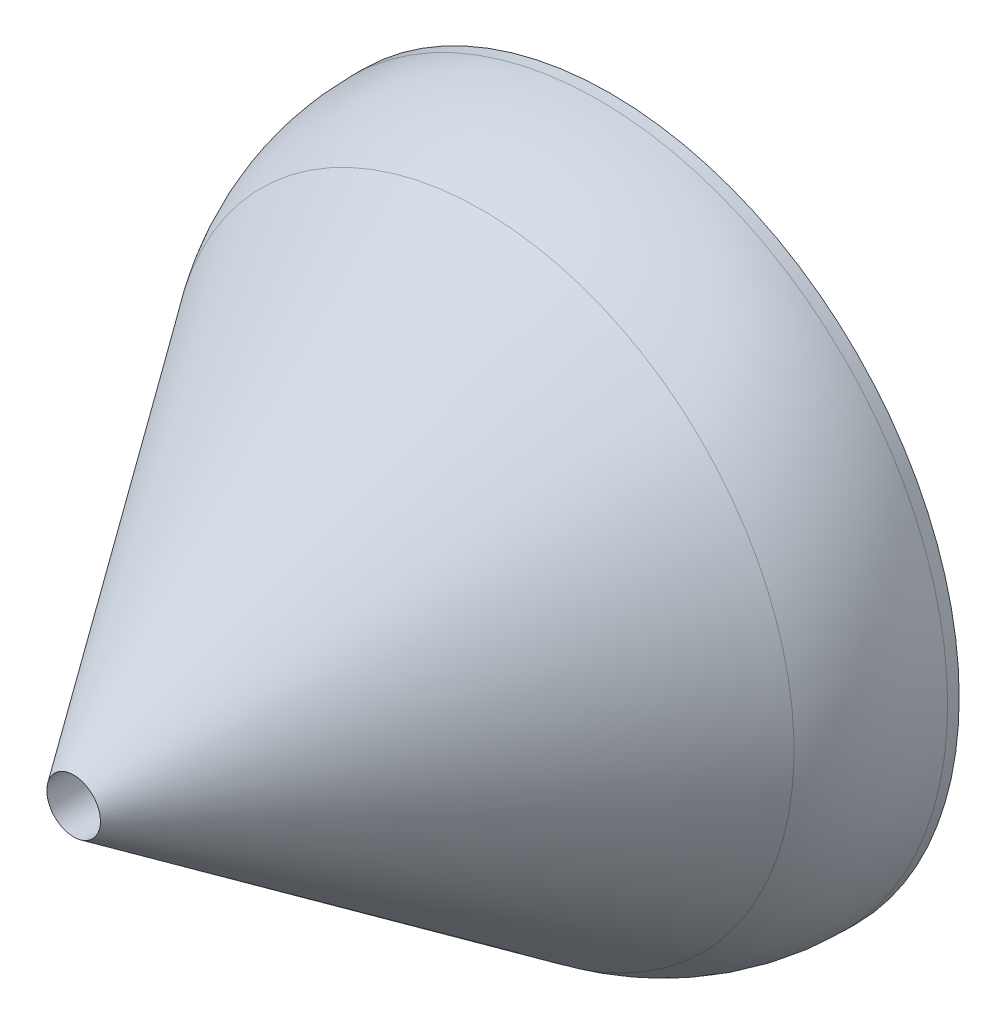
ISO-10303-21;
HEADER;
FILE_DESCRIPTION(('STEP AP214'),'2;1');
FILE_NAME('part.step','',(''),(''),'','','');
FILE_SCHEMA(('AUTOMOTIVE_DESIGN { 1 0 10303 214 1 1 1 1 }'));
ENDSEC;
DATA;
#1=APPLICATION_CONTEXT('core data for automotive mechanical design processes');
#2=APPLICATION_PROTOCOL_DEFINITION('international standard','automotive_design',2000,#1);
#3=PRODUCT_CONTEXT('',#1,'mechanical');
#4=PRODUCT('Part','Part','',(#3));
#5=PRODUCT_RELATED_PRODUCT_CATEGORY('part','',(#4));
#6=PRODUCT_DEFINITION_FORMATION('','',#4);
#7=PRODUCT_DEFINITION_CONTEXT('part definition',#1,'design');
#8=PRODUCT_DEFINITION('design','',#6,#7);
#9=PRODUCT_DEFINITION_SHAPE('','',#8);
#10=(LENGTH_UNIT() NAMED_UNIT(*) SI_UNIT(.MILLI.,.METRE.));
#11=(NAMED_UNIT(*) PLANE_ANGLE_UNIT() SI_UNIT($,.RADIAN.));
#12=(NAMED_UNIT(*) SI_UNIT($,.STERADIAN.) SOLID_ANGLE_UNIT());
#13=UNCERTAINTY_MEASURE_WITH_UNIT(LENGTH_MEASURE(1.E-05),#10,'distance_accuracy_value','');
#14=(GEOMETRIC_REPRESENTATION_CONTEXT(3) GLOBAL_UNCERTAINTY_ASSIGNED_CONTEXT((#13)) GLOBAL_UNIT_ASSIGNED_CONTEXT((#10,
#11,#12)) REPRESENTATION_CONTEXT('',''));
#15=CARTESIAN_POINT('',(0.,0.,0.));
#16=DIRECTION('',(0.,0.,1.));
#17=DIRECTION('',(1.,0.,0.));
#18=AXIS2_PLACEMENT_3D('',#15,#16,#17);
#19=CARTESIAN_POINT('',(0.,-82.55,0.));
#20=DIRECTION('',(0.,0.,1.));
#21=DIRECTION('',(1.,0.,0.));
#22=AXIS2_PLACEMENT_3D('',#19,#20,#21);
#23=PLANE('',#22);
#24=CARTESIAN_POINT('',(0.,0.,0.));
#25=DIRECTION('',(0.,0.,-1.));
#26=DIRECTION('',(-1.,0.,0.));
#27=AXIS2_PLACEMENT_3D('',#24,#25,#26);
#28=CIRCLE('',#27,63.5);
#29=CARTESIAN_POINT('',(-63.5,0.,0.));
#30=VERTEX_POINT('',#29);
#31=EDGE_CURVE('E50',#30,#30,#28,.T.);
#32=ORIENTED_EDGE('',*,*,#31,.F.);
#33=EDGE_LOOP('',(#32));
#34=FACE_BOUND('',#33,.T.);
#35=CARTESIAN_POINT('',(0.,0.,0.));
#36=DIRECTION('',(0.,0.,-1.));
#37=DIRECTION('',(-1.,0.,0.));
#38=AXIS2_PLACEMENT_3D('',#35,#36,#37);
#39=CIRCLE('',#38,82.55);
#40=CARTESIAN_POINT('',(-82.55,0.,0.));
#41=VERTEX_POINT('',#40);
#42=EDGE_CURVE('E77',#41,#41,#39,.T.);
#43=ORIENTED_EDGE('',*,*,#42,.T.);
#44=EDGE_LOOP('',(#43));
#45=FACE_BOUND('',#44,.T.);
#46=ADVANCED_FACE('F39',(#34,#45),#23,.F.);
#47=CARTESIAN_POINT('',(0.,0.,0.));
#48=DIRECTION('',(0.,0.,-1.));
#49=DIRECTION('',(-1.,0.,0.));
#50=AXIS2_PLACEMENT_3D('',#47,#48,#49);
#51=CYLINDRICAL_SURFACE('',#50,63.5);
#52=CARTESIAN_POINT('',(0.,0.,17.9279650369389));
#53=DIRECTION('',(0.,0.,-1.));
#54=DIRECTION('',(-1.,0.,0.));
#55=AXIS2_PLACEMENT_3D('',#52,#53,#54);
#56=CIRCLE('',#55,63.5);
#57=CARTESIAN_POINT('',(-63.5,0.,17.9279650369389));
#58=VERTEX_POINT('',#57);
#59=EDGE_CURVE('E54',#58,#58,#56,.T.);
#60=ORIENTED_EDGE('',*,*,#59,.F.);
#61=EDGE_LOOP('',(#60));
#62=FACE_BOUND('',#61,.T.);
#63=ORIENTED_EDGE('',*,*,#31,.T.);
#64=EDGE_LOOP('',(#63));
#65=FACE_BOUND('',#64,.T.);
#66=ADVANCED_FACE('F94',(#62,#65),#51,.F.);
#67=CARTESIAN_POINT('',(0.,0.,17.9279650369389));
#68=DIRECTION('',(0.,0.,-1.));
#69=DIRECTION('',(-1.,0.,0.));
#70=AXIS2_PLACEMENT_3D('',#67,#68,#69);
#71=CONICAL_SURFACE('',#70,63.5,0.609799774213929);
#72=CARTESIAN_POINT('',(0.,0.,56.8087310586471));
#73=DIRECTION('',(0.,0.,-1.));
#74=DIRECTION('',(-1.,0.,0.));
#75=AXIS2_PLACEMENT_3D('',#72,#73,#74);
#76=CIRCLE('',#75,36.3370854008772);
#77=CARTESIAN_POINT('',(-36.3370854008772,0.,56.8087310586471));
#78=VERTEX_POINT('',#77);
#79=EDGE_CURVE('E59',#78,#78,#76,.T.);
#80=ORIENTED_EDGE('',*,*,#79,.F.);
#81=EDGE_LOOP('',(#80));
#82=FACE_BOUND('',#81,.T.);
#83=ORIENTED_EDGE('',*,*,#59,.T.);
#84=EDGE_LOOP('',(#83));
#85=FACE_BOUND('',#84,.T.);
#86=ADVANCED_FACE('F99',(#82,#85),#71,.F.);
#87=CARTESIAN_POINT('',(0.,-36.3370854008772,56.8087310586471));
#88=DIRECTION('',(0.,0.,1.));
#89=DIRECTION('',(1.,0.,0.));
#90=AXIS2_PLACEMENT_3D('',#87,#88,#89);
#91=PLANE('',#90);
#92=CARTESIAN_POINT('',(0.,0.,56.8087310586471));
#93=DIRECTION('',(0.,0.,-1.));
#94=DIRECTION('',(-1.,0.,0.));
#95=AXIS2_PLACEMENT_3D('',#92,#93,#94);
#96=CIRCLE('',#95,6.35000000000001);
#97=CARTESIAN_POINT('',(-6.35000000000001,0.,56.8087310586471));
#98=VERTEX_POINT('',#97);
#99=EDGE_CURVE('E62',#98,#98,#96,.T.);
#100=ORIENTED_EDGE('',*,*,#99,.F.);
#101=EDGE_LOOP('',(#100));
#102=FACE_BOUND('',#101,.T.);
#103=ORIENTED_EDGE('',*,*,#79,.T.);
#104=EDGE_LOOP('',(#103));
#105=FACE_BOUND('',#104,.T.);
#106=ADVANCED_FACE('F106',(#102,#105),#91,.F.);
#107=CARTESIAN_POINT('',(0.,0.,0.));
#108=DIRECTION('',(0.,0.,-1.));
#109=DIRECTION('',(-1.,0.,0.));
#110=AXIS2_PLACEMENT_3D('',#107,#108,#109);
#111=CYLINDRICAL_SURFACE('',#110,6.35000000000001);
#112=CARTESIAN_POINT('',(0.,0.,69.5087310586471));
#113=DIRECTION('',(0.,0.,-1.));
#114=DIRECTION('',(-1.,0.,0.));
#115=AXIS2_PLACEMENT_3D('',#112,#113,#114);
#116=CIRCLE('',#115,6.35000000000001);
#117=CARTESIAN_POINT('',(-6.35000000000001,0.,69.5087310586471));
#118=VERTEX_POINT('',#117);
#119=EDGE_CURVE('E65',#118,#118,#116,.T.);
#120=ORIENTED_EDGE('',*,*,#119,.F.);
#121=EDGE_LOOP('',(#120));
#122=FACE_BOUND('',#121,.T.);
#123=ORIENTED_EDGE('',*,*,#99,.T.);
#124=EDGE_LOOP('',(#123));
#125=FACE_BOUND('',#124,.T.);
#126=ADVANCED_FACE('F110',(#122,#125),#111,.F.);
#127=CARTESIAN_POINT('',(0.,-6.35000000000001,69.5087310586471));
#128=DIRECTION('',(0.,0.,-1.));
#129=DIRECTION('',(-1.,0.,0.));
#130=AXIS2_PLACEMENT_3D('',#127,#128,#129);
#131=PLANE('',#130);
#132=CARTESIAN_POINT('',(0.,0.,69.5087310586471));
#133=DIRECTION('',(0.,0.,-1.));
#134=DIRECTION('',(-1.,0.,0.));
#135=AXIS2_PLACEMENT_3D('',#132,#133,#134);
#136=CIRCLE('',#135,27.4646003470526);
#137=CARTESIAN_POINT('',(-27.4646003470526,0.,69.5087310586471));
#138=VERTEX_POINT('',#137);
#139=EDGE_CURVE('E68',#138,#138,#136,.T.);
#140=ORIENTED_EDGE('',*,*,#139,.F.);
#141=EDGE_LOOP('',(#140));
#142=FACE_BOUND('',#141,.T.);
#143=ORIENTED_EDGE('',*,*,#119,.T.);
#144=EDGE_LOOP('',(#143));
#145=FACE_BOUND('',#144,.T.);
#146=ADVANCED_FACE('F114',(#142,#145),#131,.F.);
#147=CARTESIAN_POINT('',(0.,0.,69.5087310586471));
#148=DIRECTION('',(0.,0.,-1.));
#149=DIRECTION('',(-1.,0.,0.));
#150=AXIS2_PLACEMENT_3D('',#147,#148,#149);
#151=CONICAL_SURFACE('',#150,27.4646003470526,0.609799774213929);
#152=CARTESIAN_POINT('',(0.,0.,99.7319912592347));
#153=DIRECTION('',(0.,0.,-1.));
#154=DIRECTION('',(-1.,0.,0.));
#155=AXIS2_PLACEMENT_3D('',#152,#153,#154);
#156=CIRCLE('',#155,6.35000000000004);
#157=CARTESIAN_POINT('',(-6.35000000000004,0.,99.7319912592347));
#158=VERTEX_POINT('',#157);
#159=EDGE_CURVE('E71',#158,#158,#156,.T.);
#160=CARTESIAN_POINT('',(-6.35000000000004,0.,99.7319912592347));
#161=CARTESIAN_POINT('',(-6.56994375361517,0.,99.4171656321453));
#162=CARTESIAN_POINT('',(-6.7898875072303,0.,99.1023400050558));
#163=CARTESIAN_POINT('',(-7.22977501446056,0.,98.4726887508769));
#164=CARTESIAN_POINT('',(-7.44971876807569,0.,98.1578631237875));
#165=CARTESIAN_POINT('',(-7.88960627530595,0.,97.5282118696086));
#166=CARTESIAN_POINT('',(-8.10955002892108,0.,97.2133862425191));
#167=CARTESIAN_POINT('',(-8.54943753615134,0.,96.5837349883402));
#168=CARTESIAN_POINT('',(-8.76938128976647,0.,96.2689093612507));
#169=CARTESIAN_POINT('',(-9.20926879699673,0.,95.6392581070718));
#170=CARTESIAN_POINT('',(-9.42921255061187,0.,95.3244324799824));
#171=CARTESIAN_POINT('',(-9.86910005784213,0.,94.6947812258035));
#172=CARTESIAN_POINT('',(-10.0890438114573,0.,94.379955598714));
#173=CARTESIAN_POINT('',(-10.5289313186875,0.,93.7503043445351));
#174=CARTESIAN_POINT('',(-10.7488750723026,0.,93.4354787174457));
#175=CARTESIAN_POINT('',(-11.1887625795329,0.,92.8058274632668));
#176=CARTESIAN_POINT('',(-11.408706333148,0.,92.4910018361773));
#177=CARTESIAN_POINT('',(-11.8485938403783,0.,91.8613505819984));
#178=CARTESIAN_POINT('',(-12.0685375939934,0.,91.5465249549089));
#179=CARTESIAN_POINT('',(-12.5084251012237,0.,90.91687370073));
#180=CARTESIAN_POINT('',(-12.7283688548388,0.,90.6020480736406));
#181=CARTESIAN_POINT('',(-13.1682563620691,0.,89.9723968194617));
#182=CARTESIAN_POINT('',(-13.3882001156842,0.,89.6575711923722));
#183=CARTESIAN_POINT('',(-13.8280876229145,0.,89.0279199381933));
#184=CARTESIAN_POINT('',(-14.0480313765296,0.,88.7130943111038));
#185=CARTESIAN_POINT('',(-14.4879188837599,0.,88.0834430569249));
#186=CARTESIAN_POINT('',(-14.707862637375,0.,87.7686174298355));
#187=CARTESIAN_POINT('',(-15.1477501446053,0.,87.1389661756566));
#188=CARTESIAN_POINT('',(-15.3676938982204,0.,86.8241405485671));
#189=CARTESIAN_POINT('',(-15.8075814054506,0.,86.1944892943882));
#190=CARTESIAN_POINT('',(-16.0275251590658,0.,85.8796636672988));
#191=CARTESIAN_POINT('',(-16.467412666296,0.,85.2500124131198));
#192=CARTESIAN_POINT('',(-16.6873564199112,0.,84.9351867860304));
#193=CARTESIAN_POINT('',(-17.1272439271414,0.,84.3055355318515));
#194=CARTESIAN_POINT('',(-17.3471876807566,0.,83.990709904762));
#195=CARTESIAN_POINT('',(-17.7870751879868,0.,83.3610586505831));
#196=CARTESIAN_POINT('',(-18.007018941602,0.,83.0462330234937));
#197=CARTESIAN_POINT('',(-18.4469064488322,0.,82.4165817693148));
#198=CARTESIAN_POINT('',(-18.6668502024474,0.,82.1017561422253));
#199=CARTESIAN_POINT('',(-19.1067377096776,0.,81.4721048880464));
#200=CARTESIAN_POINT('',(-19.3266814632927,0.,81.1572792609569));
#201=CARTESIAN_POINT('',(-19.766568970523,0.,80.527628006778));
#202=CARTESIAN_POINT('',(-19.9865127241381,0.,80.2128023796886));
#203=CARTESIAN_POINT('',(-20.4264002313684,0.,79.5831511255097));
#204=CARTESIAN_POINT('',(-20.6463439849835,0.,79.2683254984202));
#205=CARTESIAN_POINT('',(-21.0862314922138,0.,78.6386742442413));
#206=CARTESIAN_POINT('',(-21.3061752458289,0.,78.3238486171518));
#207=CARTESIAN_POINT('',(-21.7460627530592,0.,77.6941973629729));
#208=CARTESIAN_POINT('',(-21.9660065066743,0.,77.3793717358835));
#209=CARTESIAN_POINT('',(-22.4058940139046,0.,76.7497204817046));
#210=CARTESIAN_POINT('',(-22.6258377675197,0.,76.4348948546151));
#211=CARTESIAN_POINT('',(-23.06572527475,0.,75.8052436004362));
#212=CARTESIAN_POINT('',(-23.2856690283651,0.,75.4904179733468));
#213=CARTESIAN_POINT('',(-23.7255565355954,0.,74.8607667191678));
#214=CARTESIAN_POINT('',(-23.9455002892105,0.,74.5459410920784));
#215=CARTESIAN_POINT('',(-24.3853877964407,0.,73.9162898378995));
#216=CARTESIAN_POINT('',(-24.6053315500559,0.,73.60146421081));
#217=CARTESIAN_POINT('',(-25.0452190572861,0.,72.9718129566311));
#218=CARTESIAN_POINT('',(-25.2651628109013,0.,72.6569873295417));
#219=CARTESIAN_POINT('',(-25.7050503181315,0.,72.0273360753628));
#220=CARTESIAN_POINT('',(-25.9249940717467,0.,71.7125104482733));
#221=CARTESIAN_POINT('',(-26.3648815789769,0.,71.0828591940944));
#222=CARTESIAN_POINT('',(-26.5848253325921,0.,70.7680335670049));
#223=CARTESIAN_POINT('',(-27.0247128398223,0.,70.138382312826));
#224=CARTESIAN_POINT('',(-27.2446565934374,0.,69.8235566857366));
#225=CARTESIAN_POINT('',(-27.4646003470526,0.,69.5087310586471));
#226=B_SPLINE_CURVE_WITH_KNOTS('',3,(#160,#161,#162,#163,#164,#165,#166,#167,#168,#169,#170,
#171,#172,#173,#174,#175,#176,#177,#178,#179,#180,#181,#182,#183,#184,#185,#186,#187,#188,#189,
#190,#191,#192,#193,#194,#195,#196,#197,#198,#199,#200,#201,#202,#203,#204,#205,#206,#207,#208,
#209,#210,#211,#212,#213,#214,#215,#216,#217,#218,#219,#220,#221,#222,#223,#224,#225),
.UNSPECIFIED.,.F.,.F.,(4,2,2,2,2,2,2,2,2,2,2,2,2,2,2,2,2,2,2,2,2,2,2,2,2,2,2,2,2,2,2,2,4),(0.,
1.15213448522264,2.30426897044528,3.45640345566792,4.60853794089055,5.76067242611319,
6.91280691133582,8.06494139655846,9.2170758817811,10.3692103670037,11.5213448522264,
12.673479337449,13.8256138226717,14.9777483078943,16.1298827931169,17.2820172783396,
18.4341517635622,19.5862862487848,20.7384207340075,21.8905552192301,23.0426897044528,
24.1948241896754,25.346958674898,26.4990931601207,27.6512276453433,28.803362130566,
29.9554966157886,31.1076311010112,32.2597655862339,33.4119000714565,34.5640345566791,
35.7161690419018,36.8683035271244),.UNSPECIFIED.);
#227=EDGE_CURVE('BSEAM118',#158,#138,#226,.T.);
#228=ORIENTED_EDGE('',*,*,#159,.F.);
#229=ORIENTED_EDGE('',*,*,#139,.T.);
#230=ORIENTED_EDGE('',*,*,#227,.T.);
#231=ORIENTED_EDGE('',*,*,#227,.F.);
#232=EDGE_LOOP('',(#228,#230,#229,#231));
#233=FACE_BOUND('',#232,.T.);
#234=ADVANCED_FACE('F118',(#233),#151,.F.);
#235=CARTESIAN_POINT('',(0.,0.,0.));
#236=DIRECTION('',(0.,0.,-1.));
#237=DIRECTION('',(-1.,0.,0.));
#238=AXIS2_PLACEMENT_3D('',#235,#236,#237);
#239=CYLINDRICAL_SURFACE('',#238,6.35000000000005);
#240=CARTESIAN_POINT('',(0.,0.,127.));
#241=DIRECTION('',(0.,0.,-1.));
#242=DIRECTION('',(-1.,0.,0.));
#243=AXIS2_PLACEMENT_3D('',#240,#241,#242);
#244=CIRCLE('',#243,6.35000000000005);
#245=CARTESIAN_POINT('',(-6.35000000000004,0.,127.));
#246=VERTEX_POINT('',#245);
#247=EDGE_CURVE('E74',#246,#246,#244,.T.);
#248=ORIENTED_EDGE('',*,*,#247,.F.);
#249=EDGE_LOOP('',(#248));
#250=FACE_BOUND('',#249,.T.);
#251=ORIENTED_EDGE('',*,*,#159,.T.);
#252=EDGE_LOOP('',(#251));
#253=FACE_BOUND('',#252,.T.);
#254=ADVANCED_FACE('F91',(#250,#253),#239,.F.);
#255=CARTESIAN_POINT('',(0.,0.,127.));
#256=DIRECTION('',(0.,0.,-1.));
#257=DIRECTION('',(-1.,0.,0.));
#258=AXIS2_PLACEMENT_3D('',#255,#256,#257);
#259=CONICAL_SURFACE('',#258,6.35000000000005,0.609799774213929);
#260=CARTESIAN_POINT('',(0.,0.,30.3785691651227));
#261=DIRECTION('',(0.,0.,1.));
#262=DIRECTION('',(1.,0.,0.));
#263=AXIS2_PLACEMENT_3D('',#260,#261,#262);
#264=CIRCLE('',#263,73.8517481072127);
#265=CARTESIAN_POINT('',(-73.8517481072127,0.,30.3785691651227));
#266=VERTEX_POINT('',#265);
#267=EDGE_CURVE('E10',#266,#266,#264,.T.);
#268=CARTESIAN_POINT('',(-73.8517481072127,0.,30.3785691651227));
#269=CARTESIAN_POINT('',(-73.1486048977626,0.,31.3850424029861));
#270=CARTESIAN_POINT('',(-72.4454616883125,0.,32.3915156408494));
#271=CARTESIAN_POINT('',(-71.0391752694122,0.,34.404462116576));
#272=CARTESIAN_POINT('',(-70.3360320599621,0.,35.4109353544393));
#273=CARTESIAN_POINT('',(-68.9297456410618,0.,37.4238818301659));
#274=CARTESIAN_POINT('',(-68.2266024316117,0.,38.4303550680292));
#275=CARTESIAN_POINT('',(-66.8203160127114,0.,40.4433015437558));
#276=CARTESIAN_POINT('',(-66.1171728032613,0.,41.4497747816191));
#277=CARTESIAN_POINT('',(-64.710886384361,0.,43.4627212573457));
#278=CARTESIAN_POINT('',(-64.0077431749109,0.,44.469194495209));
#279=CARTESIAN_POINT('',(-62.6014567560106,0.,46.4821409709356));
#280=CARTESIAN_POINT('',(-61.8983135465605,0.,47.4886142087989));
#281=CARTESIAN_POINT('',(-60.4920271276602,0.,49.5015606845255));
#282=CARTESIAN_POINT('',(-59.7888839182101,0.,50.5080339223888));
#283=CARTESIAN_POINT('',(-58.3825974993098,0.,52.5209803981155));
#284=CARTESIAN_POINT('',(-57.6794542898597,0.,53.5274536359788));
#285=CARTESIAN_POINT('',(-56.2731678709594,0.,55.5404001117054));
#286=CARTESIAN_POINT('',(-55.5700246615093,0.,56.5468733495687));
#287=CARTESIAN_POINT('',(-54.163738242609,0.,58.5598198252953));
#288=CARTESIAN_POINT('',(-53.4605950331589,0.,59.5662930631586));
#289=CARTESIAN_POINT('',(-52.0543086142586,0.,61.5792395388852));
#290=CARTESIAN_POINT('',(-51.3511654048085,0.,62.5857127767485));
#291=CARTESIAN_POINT('',(-49.9448789859082,0.,64.5986592524751));
#292=CARTESIAN_POINT('',(-49.2417357764581,0.,65.6051324903384));
#293=CARTESIAN_POINT('',(-47.8354493575578,0.,67.618078966065));
#294=CARTESIAN_POINT('',(-47.1323061481077,0.,68.6245522039283));
#295=CARTESIAN_POINT('',(-45.7260197292075,0.,70.637498679655));
#296=CARTESIAN_POINT('',(-45.0228765197573,0.,71.6439719175182));
#297=CARTESIAN_POINT('',(-43.616590100857,0.,73.6569183932449));
#298=CARTESIAN_POINT('',(-42.9134468914069,0.,74.6633916311082));
#299=CARTESIAN_POINT('',(-41.5071604725066,0.,76.6763381068348));
#300=CARTESIAN_POINT('',(-40.8040172630565,0.,77.6828113446981));
#301=CARTESIAN_POINT('',(-39.3977308441563,0.,79.6957578204247));
#302=CARTESIAN_POINT('',(-38.6945876347061,0.,80.702231058288));
#303=CARTESIAN_POINT('',(-37.2883012158059,0.,82.7151775340146));
#304=CARTESIAN_POINT('',(-36.5851580063557,0.,83.7216507718779));
#305=CARTESIAN_POINT('',(-35.1788715874555,0.,85.7345972476045));
#306=CARTESIAN_POINT('',(-34.4757283780053,0.,86.7410704854678));
#307=CARTESIAN_POINT('',(-33.0694419591051,0.,88.7540169611944));
#308=CARTESIAN_POINT('',(-32.3662987496549,0.,89.7604901990577));
#309=CARTESIAN_POINT('',(-30.9600123307547,0.,91.7734366747843));
#310=CARTESIAN_POINT('',(-30.2568691213045,0.,92.7799099126476));
#311=CARTESIAN_POINT('',(-28.8505827024043,0.,94.7928563883743));
#312=CARTESIAN_POINT('',(-28.1474394929541,0.,95.7993296262376));
#313=CARTESIAN_POINT('',(-26.7411530740539,0.,97.8122761019642));
#314=CARTESIAN_POINT('',(-26.0380098646037,0.,98.8187493398275));
#315=CARTESIAN_POINT('',(-24.6317234457035,0.,100.831695815554));
#316=CARTESIAN_POINT('',(-23.9285802362533,0.,101.838169053417));
#317=CARTESIAN_POINT('',(-22.5222938173531,0.,103.851115529144));
#318=CARTESIAN_POINT('',(-21.8191506079029,0.,104.857588767007));
#319=CARTESIAN_POINT('',(-20.4128641890027,0.,106.870535242734));
#320=CARTESIAN_POINT('',(-19.7097209795526,0.,107.877008480597));
#321=CARTESIAN_POINT('',(-18.3034345606523,0.,109.889954956324));
#322=CARTESIAN_POINT('',(-17.6002913512022,0.,110.896428194187));
#323=CARTESIAN_POINT('',(-16.1940049323019,0.,112.909374669914));
#324=CARTESIAN_POINT('',(-15.4908617228518,0.,113.915847907777));
#325=CARTESIAN_POINT('',(-14.0845753039515,0.,115.928794383504));
#326=CARTESIAN_POINT('',(-13.3814320945014,0.,116.935267621367));
#327=CARTESIAN_POINT('',(-11.9751456756011,0.,118.948214097094));
#328=CARTESIAN_POINT('',(-11.272002466151,0.,119.954687334957));
#329=CARTESIAN_POINT('',(-9.8657160472507,0.,121.967633810683));
#330=CARTESIAN_POINT('',(-9.16257283780057,0.,122.974107048547));
#331=CARTESIAN_POINT('',(-7.75628641890031,0.,124.987053524273));
#332=CARTESIAN_POINT('',(-7.05314320945017,0.,125.993526762137));
#333=CARTESIAN_POINT('',(-6.35000000000004,0.,127.));
#334=B_SPLINE_CURVE_WITH_KNOTS('',3,(#268,#269,#270,#271,#272,#273,#274,#275,#276,#277,#278,
#279,#280,#281,#282,#283,#284,#285,#286,#287,#288,#289,#290,#291,#292,#293,#294,#295,#296,#297,
#298,#299,#300,#301,#302,#303,#304,#305,#306,#307,#308,#309,#310,#311,#312,#313,#314,#315,#316,
#317,#318,#319,#320,#321,#322,#323,#324,#325,#326,#327,#328,#329,#330,#331,#332,#333),
.UNSPECIFIED.,.F.,.F.,(4,2,2,2,2,2,2,2,2,2,2,2,2,2,2,2,2,2,2,2,2,2,2,2,2,2,2,2,2,2,2,2,4),(0.,
3.68328505057346,7.3665701011469,11.0498551517204,14.7331402022938,18.4164252528673,
22.0997103034407,25.7829953540142,29.4662804045876,33.1495654551611,36.8328505057345,
40.516135556308,44.1994206068814,47.8827056574549,51.5659907080284,55.2492757586018,
58.9325608091753,62.6158458597487,66.2991309103222,69.9824159608956,73.6657010114691,
77.3489860620425,81.032271112616,84.7155561631894,88.3988412137629,92.0821262643363,
95.7654113149098,99.4486963654832,103.131981416057,106.81526646663,110.498551517204,
114.181836567777,117.86512161835),.UNSPECIFIED.);
#335=EDGE_CURVE('BSEAM84',#266,#246,#334,.T.);
#336=ORIENTED_EDGE('',*,*,#267,.T.);
#337=ORIENTED_EDGE('',*,*,#247,.T.);
#338=ORIENTED_EDGE('',*,*,#335,.T.);
#339=ORIENTED_EDGE('',*,*,#335,.F.);
#340=EDGE_LOOP('',(#336,#338,#337,#339));
#341=FACE_BOUND('',#340,.T.);
#342=ADVANCED_FACE('F84',(#341),#259,.T.);
#343=CARTESIAN_POINT('',(0.,0.,0.));
#344=DIRECTION('',(0.,0.,-1.));
#345=DIRECTION('',(-1.,0.,0.));
#346=AXIS2_PLACEMENT_3D('',#343,#344,#345);
#347=CYLINDRICAL_SURFACE('',#346,82.55);
#348=CARTESIAN_POINT('',(0.,0.,2.73990626871166));
#349=DIRECTION('',(0.,0.,1.));
#350=DIRECTION('',(1.,0.,0.));
#351=AXIS2_PLACEMENT_3D('',#348,#349,#350);
#352=CIRCLE('',#351,82.55);
#353=CARTESIAN_POINT('',(82.55,0.,2.73990626871166));
#354=VERTEX_POINT('',#353);
#355=EDGE_CURVE('E46',#354,#354,#352,.F.);
#356=ORIENTED_EDGE('',*,*,#355,.T.);
#357=EDGE_LOOP('',(#356));
#358=FACE_BOUND('',#357,.T.);
#359=ORIENTED_EDGE('',*,*,#42,.F.);
#360=EDGE_LOOP('',(#359));
#361=FACE_BOUND('',#360,.T.);
#362=ADVANCED_FACE('F82',(#358,#361),#347,.T.);
#363=CARTESIAN_POINT('',(0.,0.,2.73990626871166));
#364=DIRECTION('',(0.,0.,1.));
#365=DIRECTION('',(1.,0.,0.));
#366=AXIS2_PLACEMENT_3D('',#363,#364,#365);
#367=DEGENERATE_TOROIDAL_SURFACE('',#366,34.29,48.26,.T.);
#368=ORIENTED_EDGE('',*,*,#267,.F.);
#369=EDGE_LOOP('',(#368));
#370=FACE_BOUND('',#369,.T.);
#371=ORIENTED_EDGE('',*,*,#355,.F.);
#372=EDGE_LOOP('',(#371));
#373=FACE_BOUND('',#372,.T.);
#374=ADVANCED_FACE('F41',(#370,#373),#367,.T.);
#375=CLOSED_SHELL('',(#46,#66,#86,#106,#126,#146,#234,#254,#342,#362,#374));
#376=MANIFOLD_SOLID_BREP('B2',#375);
#377=ADVANCED_BREP_SHAPE_REPRESENTATION('',(#18,#376),#14);
#378=SHAPE_DEFINITION_REPRESENTATION(#9,#377);
ENDSEC;
END-ISO-10303-21;
